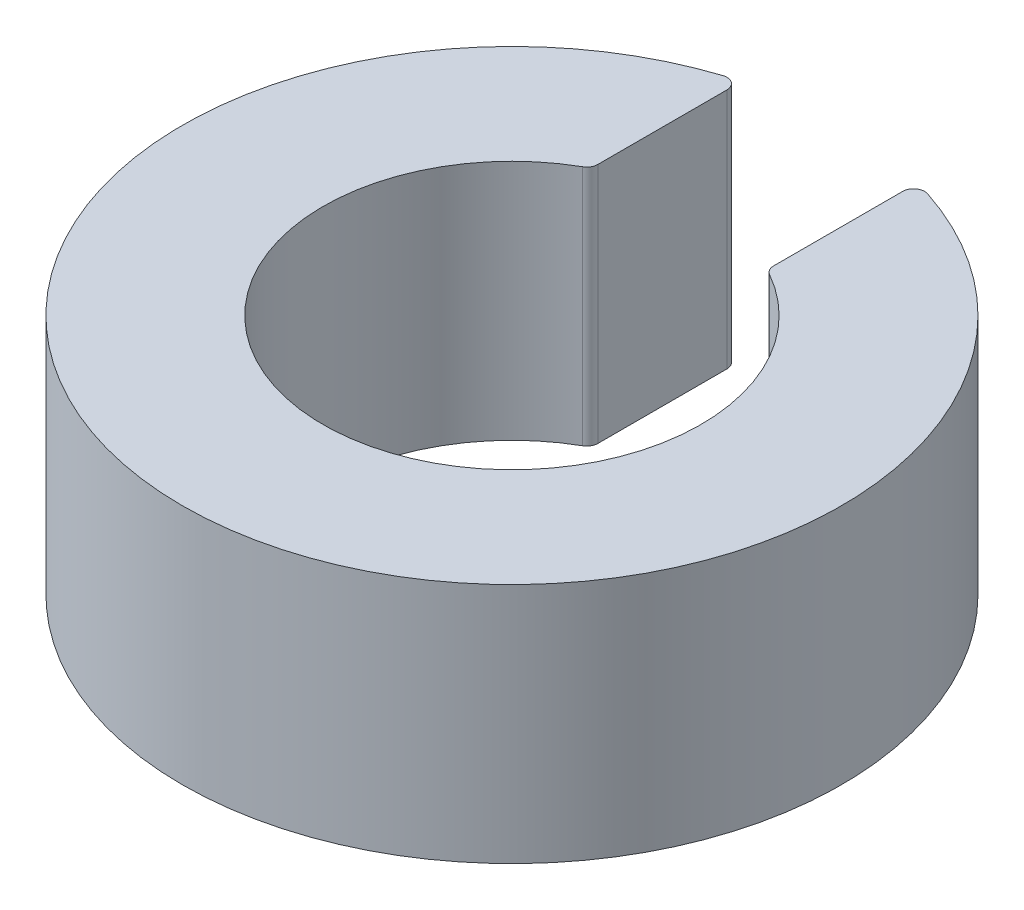
ISO-10303-21;
HEADER;
FILE_DESCRIPTION(('STEP AP214'),'2;1');
FILE_NAME('part.step','',(''),(''),'','','');
FILE_SCHEMA(('AUTOMOTIVE_DESIGN { 1 0 10303 214 1 1 1 1 }'));
ENDSEC;
DATA;
#1=APPLICATION_CONTEXT('core data for automotive mechanical design processes');
#2=APPLICATION_PROTOCOL_DEFINITION('international standard','automotive_design',2000,#1);
#3=PRODUCT_CONTEXT('',#1,'mechanical');
#4=PRODUCT('Part','Part','',(#3));
#5=PRODUCT_RELATED_PRODUCT_CATEGORY('part','',(#4));
#6=PRODUCT_DEFINITION_FORMATION('','',#4);
#7=PRODUCT_DEFINITION_CONTEXT('part definition',#1,'design');
#8=PRODUCT_DEFINITION('design','',#6,#7);
#9=PRODUCT_DEFINITION_SHAPE('','',#8);
#10=(LENGTH_UNIT() NAMED_UNIT(*) SI_UNIT(.MILLI.,.METRE.));
#11=(NAMED_UNIT(*) PLANE_ANGLE_UNIT() SI_UNIT($,.RADIAN.));
#12=(NAMED_UNIT(*) SI_UNIT($,.STERADIAN.) SOLID_ANGLE_UNIT());
#13=UNCERTAINTY_MEASURE_WITH_UNIT(LENGTH_MEASURE(1.E-05),#10,'distance_accuracy_value','');
#14=(GEOMETRIC_REPRESENTATION_CONTEXT(3) GLOBAL_UNCERTAINTY_ASSIGNED_CONTEXT((#13)) GLOBAL_UNIT_ASSIGNED_CONTEXT((#10,
#11,#12)) REPRESENTATION_CONTEXT('',''));
#15=CARTESIAN_POINT('',(0.,0.,0.));
#16=DIRECTION('',(0.,0.,1.));
#17=DIRECTION('',(1.,0.,0.));
#18=AXIS2_PLACEMENT_3D('',#15,#16,#17);
#19=CARTESIAN_POINT('',(0.,5.5,0.));
#20=DIRECTION('',(0.,-1.,0.));
#21=DIRECTION('',(0.,0.,-1.));
#22=AXIS2_PLACEMENT_3D('',#19,#20,#21);
#23=CYLINDRICAL_SURFACE('',#22,4.3);
#24=CARTESIAN_POINT('',(0.,5.5,0.));
#25=DIRECTION('',(0.,1.,0.));
#26=DIRECTION('',(0.,0.,1.));
#27=AXIS2_PLACEMENT_3D('',#24,#25,#26);
#28=CIRCLE('',#27,4.3);
#29=CARTESIAN_POINT('',(-2.12637362637363,5.5,-3.73745036101654));
#30=VERTEX_POINT('',#29);
#31=CARTESIAN_POINT('',(2.12637362637363,5.5,-3.73745036101654));
#32=VERTEX_POINT('',#31);
#33=EDGE_CURVE('E136',#30,#32,#28,.T.);
#34=ORIENTED_EDGE('',*,*,#33,.T.);
#35=DIRECTION('',(0.,-1.,0.));
#36=VECTOR('',#35,1.);
#37=CARTESIAN_POINT('',(2.12637362637363,5.5,-3.73745036101654));
#38=LINE('',#37,#36);
#39=CARTESIAN_POINT('',(2.12637362637363,0.,-3.73745036101654));
#40=VERTEX_POINT('',#39);
#41=EDGE_CURVE('E11',#32,#40,#38,.T.);
#42=ORIENTED_EDGE('',*,*,#41,.T.);
#43=CARTESIAN_POINT('',(0.,0.,0.));
#44=DIRECTION('',(0.,1.,0.));
#45=DIRECTION('',(0.,0.,1.));
#46=AXIS2_PLACEMENT_3D('',#43,#44,#45);
#47=CIRCLE('',#46,4.3);
#48=CARTESIAN_POINT('',(-2.12637362637363,0.,-3.73745036101654));
#49=VERTEX_POINT('',#48);
#50=EDGE_CURVE('E182',#49,#40,#47,.T.);
#51=ORIENTED_EDGE('',*,*,#50,.F.);
#52=DIRECTION('',(0.,-1.,0.));
#53=VECTOR('',#52,1.);
#54=CARTESIAN_POINT('',(-2.12637362637363,5.5,-3.73745036101654));
#55=LINE('',#54,#53);
#56=EDGE_CURVE('E47',#49,#30,#55,.F.);
#57=ORIENTED_EDGE('',*,*,#56,.T.);
#58=EDGE_LOOP('',(#34,#42,#51,#57));
#59=FACE_BOUND('',#58,.T.);
#60=ADVANCED_FACE('F38',(#59),#23,.F.);
#61=CARTESIAN_POINT('',(-2.,5.5,0.));
#62=DIRECTION('',(1.,0.,0.));
#63=DIRECTION('',(0.,0.,-1.));
#64=AXIS2_PLACEMENT_3D('',#61,#62,#63);
#65=PLANE('',#64);
#66=DIRECTION('',(0.,0.,1.));
#67=VECTOR('',#66,1.);
#68=CARTESIAN_POINT('',(-2.,0.,0.));
#69=LINE('',#68,#67);
#70=CARTESIAN_POINT('',(-2.,0.,-6.89202437604511));
#71=VERTEX_POINT('',#70);
#72=CARTESIAN_POINT('',(-2.,0.,-3.95474398665704));
#73=VERTEX_POINT('',#72);
#74=EDGE_CURVE('E144',#71,#73,#69,.T.);
#75=ORIENTED_EDGE('',*,*,#74,.F.);
#76=DIRECTION('',(0.,1.,0.));
#77=VECTOR('',#76,1.);
#78=CARTESIAN_POINT('',(-2.,5.5,-6.89202437604511));
#79=LINE('',#78,#77);
#80=CARTESIAN_POINT('',(-2.,5.5,-6.89202437604511));
#81=VERTEX_POINT('',#80);
#82=EDGE_CURVE('E61',#71,#81,#79,.T.);
#83=ORIENTED_EDGE('',*,*,#82,.T.);
#84=DIRECTION('',(0.,0.,1.));
#85=VECTOR('',#84,1.);
#86=CARTESIAN_POINT('',(-2.,5.5,0.));
#87=LINE('',#86,#85);
#88=CARTESIAN_POINT('',(-2.,5.5,-3.95474398665704));
#89=VERTEX_POINT('',#88);
#90=EDGE_CURVE('E142',#81,#89,#87,.T.);
#91=ORIENTED_EDGE('',*,*,#90,.T.);
#92=DIRECTION('',(0.,-1.,0.));
#93=VECTOR('',#92,1.);
#94=CARTESIAN_POINT('',(-2.,5.5,-3.95474398665704));
#95=LINE('',#94,#93);
#96=EDGE_CURVE('E172',#89,#73,#95,.T.);
#97=ORIENTED_EDGE('',*,*,#96,.T.);
#98=EDGE_LOOP('',(#75,#83,#91,#97));
#99=FACE_BOUND('',#98,.T.);
#100=ADVANCED_FACE('F189',(#99),#65,.T.);
#101=CARTESIAN_POINT('',(0.,5.5,0.));
#102=DIRECTION('',(0.,-1.,0.));
#103=DIRECTION('',(0.,0.,-1.));
#104=AXIS2_PLACEMENT_3D('',#101,#102,#103);
#105=CYLINDRICAL_SURFACE('',#104,7.5);
#106=CARTESIAN_POINT('',(0.,0.,0.));
#107=DIRECTION('',(0.,1.,0.));
#108=DIRECTION('',(0.,0.,1.));
#109=AXIS2_PLACEMENT_3D('',#106,#107,#108);
#110=CIRCLE('',#109,7.5);
#111=CARTESIAN_POINT('',(-2.32758620689655,0.,-7.12968038901218));
#112=VERTEX_POINT('',#111);
#113=CARTESIAN_POINT('',(2.32758620689655,0.,-7.12968038901218));
#114=VERTEX_POINT('',#113);
#115=EDGE_CURVE('E137',#112,#114,#110,.T.);
#116=ORIENTED_EDGE('',*,*,#115,.T.);
#117=DIRECTION('',(0.,-1.,0.));
#118=VECTOR('',#117,1.);
#119=CARTESIAN_POINT('',(2.32758620689655,5.5,-7.12968038901218));
#120=LINE('',#119,#118);
#121=CARTESIAN_POINT('',(2.32758620689655,5.5,-7.12968038901218));
#122=VERTEX_POINT('',#121);
#123=EDGE_CURVE('E111',#114,#122,#120,.F.);
#124=ORIENTED_EDGE('',*,*,#123,.T.);
#125=CARTESIAN_POINT('',(0.,5.5,0.));
#126=DIRECTION('',(0.,1.,0.));
#127=DIRECTION('',(0.,0.,1.));
#128=AXIS2_PLACEMENT_3D('',#125,#126,#127);
#129=CIRCLE('',#128,7.5);
#130=CARTESIAN_POINT('',(-2.32758620689655,5.5,-7.12968038901218));
#131=VERTEX_POINT('',#130);
#132=EDGE_CURVE('E196',#131,#122,#129,.T.);
#133=ORIENTED_EDGE('',*,*,#132,.F.);
#134=DIRECTION('',(0.,-1.,0.));
#135=VECTOR('',#134,1.);
#136=CARTESIAN_POINT('',(-2.32758620689655,5.5,-7.12968038901218));
#137=LINE('',#136,#135);
#138=EDGE_CURVE('E117',#131,#112,#137,.T.);
#139=ORIENTED_EDGE('',*,*,#138,.T.);
#140=EDGE_LOOP('',(#116,#124,#133,#139));
#141=FACE_BOUND('',#140,.T.);
#142=ADVANCED_FACE('F204',(#141),#105,.T.);
#143=CARTESIAN_POINT('',(2.,5.5,0.));
#144=DIRECTION('',(1.,0.,0.));
#145=DIRECTION('',(0.,0.,-1.));
#146=AXIS2_PLACEMENT_3D('',#143,#144,#145);
#147=PLANE('',#146);
#148=DIRECTION('',(0.,0.,1.));
#149=VECTOR('',#148,1.);
#150=CARTESIAN_POINT('',(2.,5.5,0.));
#151=LINE('',#150,#149);
#152=CARTESIAN_POINT('',(2.,5.5,-6.89202437604511));
#153=VERTEX_POINT('',#152);
#154=CARTESIAN_POINT('',(2.,5.5,-3.95474398665704));
#155=VERTEX_POINT('',#154);
#156=EDGE_CURVE('E127',#153,#155,#151,.T.);
#157=ORIENTED_EDGE('',*,*,#156,.F.);
#158=DIRECTION('',(0.,-1.,0.));
#159=VECTOR('',#158,1.);
#160=CARTESIAN_POINT('',(2.,5.5,-6.89202437604511));
#161=LINE('',#160,#159);
#162=CARTESIAN_POINT('',(2.,0.,-6.89202437604511));
#163=VERTEX_POINT('',#162);
#164=EDGE_CURVE('E110',#153,#163,#161,.T.);
#165=ORIENTED_EDGE('',*,*,#164,.T.);
#166=DIRECTION('',(0.,0.,1.));
#167=VECTOR('',#166,1.);
#168=CARTESIAN_POINT('',(2.,0.,0.));
#169=LINE('',#168,#167);
#170=CARTESIAN_POINT('',(2.,0.,-3.95474398665704));
#171=VERTEX_POINT('',#170);
#172=EDGE_CURVE('E124',#163,#171,#169,.T.);
#173=ORIENTED_EDGE('',*,*,#172,.T.);
#174=DIRECTION('',(0.,1.,0.));
#175=VECTOR('',#174,1.);
#176=CARTESIAN_POINT('',(2.,5.5,-3.95474398665704));
#177=LINE('',#176,#175);
#178=EDGE_CURVE('E130',#171,#155,#177,.T.);
#179=ORIENTED_EDGE('',*,*,#178,.T.);
#180=EDGE_LOOP('',(#157,#165,#173,#179));
#181=FACE_BOUND('',#180,.T.);
#182=ADVANCED_FACE('F123',(#181),#147,.F.);
#183=CARTESIAN_POINT('',(0.,5.5,0.));
#184=DIRECTION('',(0.,1.,0.));
#185=DIRECTION('',(0.,0.,1.));
#186=AXIS2_PLACEMENT_3D('',#183,#184,#185);
#187=PLANE('',#186);
#188=ORIENTED_EDGE('',*,*,#132,.T.);
#189=CARTESIAN_POINT('',(2.25,5.5,-6.89202437604511));
#190=DIRECTION('',(0.,1.,0.));
#191=DIRECTION('',(0.,0.,1.));
#192=AXIS2_PLACEMENT_3D('',#189,#190,#191);
#193=CIRCLE('',#192,0.25);
#194=EDGE_CURVE('E169',#122,#153,#193,.T.);
#195=ORIENTED_EDGE('',*,*,#194,.T.);
#196=ORIENTED_EDGE('',*,*,#156,.T.);
#197=CARTESIAN_POINT('',(2.25,5.5,-3.95474398665704));
#198=DIRECTION('',(0.,1.,0.));
#199=DIRECTION('',(0.,0.,1.));
#200=AXIS2_PLACEMENT_3D('',#197,#198,#199);
#201=CIRCLE('',#200,0.25);
#202=EDGE_CURVE('E163',#155,#32,#201,.T.);
#203=ORIENTED_EDGE('',*,*,#202,.T.);
#204=ORIENTED_EDGE('',*,*,#33,.F.);
#205=CARTESIAN_POINT('',(-2.25,5.5,-3.95474398665704));
#206=DIRECTION('',(0.,1.,0.));
#207=DIRECTION('',(0.,0.,1.));
#208=AXIS2_PLACEMENT_3D('',#205,#206,#207);
#209=CIRCLE('',#208,0.25);
#210=EDGE_CURVE('E54',#30,#89,#209,.T.);
#211=ORIENTED_EDGE('',*,*,#210,.T.);
#212=ORIENTED_EDGE('',*,*,#90,.F.);
#213=CARTESIAN_POINT('',(-2.25,5.5,-6.89202437604511));
#214=DIRECTION('',(0.,1.,0.));
#215=DIRECTION('',(0.,0.,1.));
#216=AXIS2_PLACEMENT_3D('',#213,#214,#215);
#217=CIRCLE('',#216,0.25);
#218=EDGE_CURVE('E166',#81,#131,#217,.T.);
#219=ORIENTED_EDGE('',*,*,#218,.T.);
#220=EDGE_LOOP('',(#188,#195,#196,#203,#204,#211,#212,#219));
#221=FACE_BOUND('',#220,.T.);
#222=ADVANCED_FACE('F185',(#221),#187,.T.);
#223=CARTESIAN_POINT('',(0.,0.,0.));
#224=DIRECTION('',(0.,1.,0.));
#225=DIRECTION('',(0.,0.,1.));
#226=AXIS2_PLACEMENT_3D('',#223,#224,#225);
#227=PLANE('',#226);
#228=ORIENTED_EDGE('',*,*,#172,.F.);
#229=CARTESIAN_POINT('',(2.25,0.,-6.89202437604511));
#230=DIRECTION('',(0.,1.,0.));
#231=DIRECTION('',(0.,0.,1.));
#232=AXIS2_PLACEMENT_3D('',#229,#230,#231);
#233=CIRCLE('',#232,0.25);
#234=EDGE_CURVE('E106',#163,#114,#233,.F.);
#235=ORIENTED_EDGE('',*,*,#234,.T.);
#236=ORIENTED_EDGE('',*,*,#115,.F.);
#237=CARTESIAN_POINT('',(-2.25,0.,-6.89202437604511));
#238=DIRECTION('',(0.,1.,0.));
#239=DIRECTION('',(0.,0.,1.));
#240=AXIS2_PLACEMENT_3D('',#237,#238,#239);
#241=CIRCLE('',#240,0.25);
#242=EDGE_CURVE('E118',#112,#71,#241,.F.);
#243=ORIENTED_EDGE('',*,*,#242,.T.);
#244=ORIENTED_EDGE('',*,*,#74,.T.);
#245=CARTESIAN_POINT('',(-2.25,0.,-3.95474398665704));
#246=DIRECTION('',(0.,1.,0.));
#247=DIRECTION('',(0.,0.,1.));
#248=AXIS2_PLACEMENT_3D('',#245,#246,#247);
#249=CIRCLE('',#248,0.25);
#250=EDGE_CURVE('E129',#73,#49,#249,.F.);
#251=ORIENTED_EDGE('',*,*,#250,.T.);
#252=ORIENTED_EDGE('',*,*,#50,.T.);
#253=CARTESIAN_POINT('',(2.25,0.,-3.95474398665704));
#254=DIRECTION('',(0.,1.,0.));
#255=DIRECTION('',(0.,0.,1.));
#256=AXIS2_PLACEMENT_3D('',#253,#254,#255);
#257=CIRCLE('',#256,0.25);
#258=EDGE_CURVE('E134',#40,#171,#257,.F.);
#259=ORIENTED_EDGE('',*,*,#258,.T.);
#260=EDGE_LOOP('',(#228,#235,#236,#243,#244,#251,#252,#259));
#261=FACE_BOUND('',#260,.T.);
#262=ADVANCED_FACE('F132',(#261),#227,.F.);
#263=CARTESIAN_POINT('',(2.25,5.5,-6.89202437604511));
#264=DIRECTION('',(0.,-1.,0.));
#265=DIRECTION('',(0.,0.,-1.));
#266=AXIS2_PLACEMENT_3D('',#263,#264,#265);
#267=CYLINDRICAL_SURFACE('',#266,0.25);
#268=ORIENTED_EDGE('',*,*,#194,.F.);
#269=ORIENTED_EDGE('',*,*,#123,.F.);
#270=ORIENTED_EDGE('',*,*,#234,.F.);
#271=ORIENTED_EDGE('',*,*,#164,.F.);
#272=EDGE_LOOP('',(#268,#269,#270,#271));
#273=FACE_BOUND('',#272,.T.);
#274=ADVANCED_FACE('F109',(#273),#267,.T.);
#275=CARTESIAN_POINT('',(-2.25,5.5,-6.89202437604511));
#276=DIRECTION('',(0.,-1.,0.));
#277=DIRECTION('',(0.,0.,-1.));
#278=AXIS2_PLACEMENT_3D('',#275,#276,#277);
#279=CYLINDRICAL_SURFACE('',#278,0.25);
#280=ORIENTED_EDGE('',*,*,#218,.F.);
#281=ORIENTED_EDGE('',*,*,#82,.F.);
#282=ORIENTED_EDGE('',*,*,#242,.F.);
#283=ORIENTED_EDGE('',*,*,#138,.F.);
#284=EDGE_LOOP('',(#280,#281,#282,#283));
#285=FACE_BOUND('',#284,.T.);
#286=ADVANCED_FACE('F206',(#285),#279,.T.);
#287=CARTESIAN_POINT('',(2.25,5.5,-3.95474398665704));
#288=DIRECTION('',(0.,-1.,0.));
#289=DIRECTION('',(0.,0.,-1.));
#290=AXIS2_PLACEMENT_3D('',#287,#288,#289);
#291=CYLINDRICAL_SURFACE('',#290,0.25);
#292=ORIENTED_EDGE('',*,*,#202,.F.);
#293=ORIENTED_EDGE('',*,*,#178,.F.);
#294=ORIENTED_EDGE('',*,*,#258,.F.);
#295=ORIENTED_EDGE('',*,*,#41,.F.);
#296=EDGE_LOOP('',(#292,#293,#294,#295));
#297=FACE_BOUND('',#296,.T.);
#298=ADVANCED_FACE('F208',(#297),#291,.T.);
#299=CARTESIAN_POINT('',(-2.25,5.5,-3.95474398665704));
#300=DIRECTION('',(0.,-1.,0.));
#301=DIRECTION('',(0.,0.,-1.));
#302=AXIS2_PLACEMENT_3D('',#299,#300,#301);
#303=CYLINDRICAL_SURFACE('',#302,0.25);
#304=ORIENTED_EDGE('',*,*,#210,.F.);
#305=ORIENTED_EDGE('',*,*,#56,.F.);
#306=ORIENTED_EDGE('',*,*,#250,.F.);
#307=ORIENTED_EDGE('',*,*,#96,.F.);
#308=EDGE_LOOP('',(#304,#305,#306,#307));
#309=FACE_BOUND('',#308,.T.);
#310=ADVANCED_FACE('F40',(#309),#303,.T.);
#311=CLOSED_SHELL('',(#60,#100,#142,#182,#222,#262,#274,#286,#298,#310));
#312=MANIFOLD_SOLID_BREP('B2',#311);
#313=ADVANCED_BREP_SHAPE_REPRESENTATION('',(#18,#312),#14);
#314=SHAPE_DEFINITION_REPRESENTATION(#9,#313);
ENDSEC;
END-ISO-10303-21;
